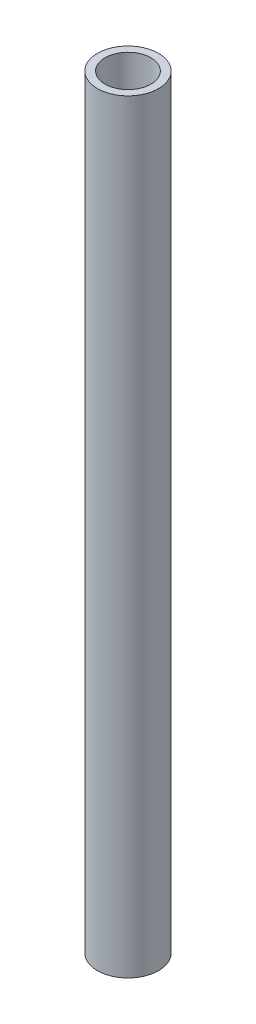
ISO-10303-21;
HEADER;
FILE_DESCRIPTION(('STEP AP214'),'2;1');
FILE_NAME('part.step','',(''),(''),'','','');
FILE_SCHEMA(('AUTOMOTIVE_DESIGN { 1 0 10303 214 1 1 1 1 }'));
ENDSEC;
DATA;
#1=APPLICATION_CONTEXT('core data for automotive mechanical design processes');
#2=APPLICATION_PROTOCOL_DEFINITION('international standard','automotive_design',2000,#1);
#3=PRODUCT_CONTEXT('',#1,'mechanical');
#4=PRODUCT('Part','Part','',(#3));
#5=PRODUCT_RELATED_PRODUCT_CATEGORY('part','',(#4));
#6=PRODUCT_DEFINITION_FORMATION('','',#4);
#7=PRODUCT_DEFINITION_CONTEXT('part definition',#1,'design');
#8=PRODUCT_DEFINITION('design','',#6,#7);
#9=PRODUCT_DEFINITION_SHAPE('','',#8);
#10=(LENGTH_UNIT() NAMED_UNIT(*) SI_UNIT(.MILLI.,.METRE.));
#11=(NAMED_UNIT(*) PLANE_ANGLE_UNIT() SI_UNIT($,.RADIAN.));
#12=(NAMED_UNIT(*) SI_UNIT($,.STERADIAN.) SOLID_ANGLE_UNIT());
#13=UNCERTAINTY_MEASURE_WITH_UNIT(LENGTH_MEASURE(1.E-05),#10,'distance_accuracy_value','');
#14=(GEOMETRIC_REPRESENTATION_CONTEXT(3) GLOBAL_UNCERTAINTY_ASSIGNED_CONTEXT((#13)) GLOBAL_UNIT_ASSIGNED_CONTEXT((#10,
#11,#12)) REPRESENTATION_CONTEXT('',''));
#15=CARTESIAN_POINT('',(0.,0.,0.));
#16=DIRECTION('',(0.,0.,1.));
#17=DIRECTION('',(1.,0.,0.));
#18=AXIS2_PLACEMENT_3D('',#15,#16,#17);
#19=CARTESIAN_POINT('',(0.,100.,0.));
#20=DIRECTION('',(0.,1.,0.));
#21=DIRECTION('',(0.,0.,1.));
#22=AXIS2_PLACEMENT_3D('',#19,#20,#21);
#23=PLANE('',#22);
#24=CARTESIAN_POINT('',(0.,100.,0.));
#25=DIRECTION('',(0.,1.,0.));
#26=DIRECTION('',(0.,0.,1.));
#27=AXIS2_PLACEMENT_3D('',#24,#25,#26);
#28=CIRCLE('',#27,4.);
#29=CARTESIAN_POINT('',(0.,100.,4.));
#30=VERTEX_POINT('',#29);
#31=EDGE_CURVE('E10',#30,#30,#28,.T.);
#32=ORIENTED_EDGE('',*,*,#31,.T.);
#33=EDGE_LOOP('',(#32));
#34=FACE_BOUND('',#33,.T.);
#35=CARTESIAN_POINT('',(0.,100.,0.));
#36=DIRECTION('',(0.,1.,0.));
#37=DIRECTION('',(0.,0.,1.));
#38=AXIS2_PLACEMENT_3D('',#35,#36,#37);
#39=CIRCLE('',#38,3.);
#40=CARTESIAN_POINT('',(0.,100.,3.));
#41=VERTEX_POINT('',#40);
#42=EDGE_CURVE('E58',#41,#41,#39,.T.);
#43=ORIENTED_EDGE('',*,*,#42,.F.);
#44=EDGE_LOOP('',(#43));
#45=FACE_BOUND('',#44,.T.);
#46=ADVANCED_FACE('F45',(#34,#45),#23,.T.);
#47=CARTESIAN_POINT('',(0.,0.,0.));
#48=DIRECTION('',(0.,1.,0.));
#49=DIRECTION('',(0.,0.,1.));
#50=AXIS2_PLACEMENT_3D('',#47,#48,#49);
#51=PLANE('',#50);
#52=CARTESIAN_POINT('',(0.,0.,0.));
#53=DIRECTION('',(0.,1.,0.));
#54=DIRECTION('',(0.,0.,1.));
#55=AXIS2_PLACEMENT_3D('',#52,#53,#54);
#56=CIRCLE('',#55,4.);
#57=CARTESIAN_POINT('',(0.,0.,4.));
#58=VERTEX_POINT('',#57);
#59=EDGE_CURVE('E49',#58,#58,#56,.T.);
#60=ORIENTED_EDGE('',*,*,#59,.F.);
#61=EDGE_LOOP('',(#60));
#62=FACE_BOUND('',#61,.T.);
#63=CARTESIAN_POINT('',(0.,0.,0.));
#64=DIRECTION('',(0.,1.,0.));
#65=DIRECTION('',(0.,0.,1.));
#66=AXIS2_PLACEMENT_3D('',#63,#64,#65);
#67=CIRCLE('',#66,3.);
#68=CARTESIAN_POINT('',(0.,0.,3.));
#69=VERTEX_POINT('',#68);
#70=EDGE_CURVE('E60',#69,#69,#67,.T.);
#71=ORIENTED_EDGE('',*,*,#70,.T.);
#72=EDGE_LOOP('',(#71));
#73=FACE_BOUND('',#72,.T.);
#74=ADVANCED_FACE('F72',(#62,#73),#51,.F.);
#75=CARTESIAN_POINT('',(0.,100.,0.));
#76=DIRECTION('',(0.,-1.,0.));
#77=DIRECTION('',(0.,0.,-1.));
#78=AXIS2_PLACEMENT_3D('',#75,#76,#77);
#79=CYLINDRICAL_SURFACE('',#78,4.);
#80=ORIENTED_EDGE('',*,*,#31,.F.);
#81=EDGE_LOOP('',(#80));
#82=FACE_BOUND('',#81,.T.);
#83=ORIENTED_EDGE('',*,*,#59,.T.);
#84=EDGE_LOOP('',(#83));
#85=FACE_BOUND('',#84,.T.);
#86=ADVANCED_FACE('F47',(#82,#85),#79,.T.);
#87=CARTESIAN_POINT('',(0.,100.,0.));
#88=DIRECTION('',(0.,-1.,0.));
#89=DIRECTION('',(0.,0.,-1.));
#90=AXIS2_PLACEMENT_3D('',#87,#88,#89);
#91=CYLINDRICAL_SURFACE('',#90,3.);
#92=ORIENTED_EDGE('',*,*,#42,.T.);
#93=EDGE_LOOP('',(#92));
#94=FACE_BOUND('',#93,.T.);
#95=ORIENTED_EDGE('',*,*,#70,.F.);
#96=EDGE_LOOP('',(#95));
#97=FACE_BOUND('',#96,.T.);
#98=ADVANCED_FACE('F68',(#94,#97),#91,.F.);
#99=CLOSED_SHELL('',(#46,#74,#86,#98));
#100=MANIFOLD_SOLID_BREP('B2',#99);
#101=ADVANCED_BREP_SHAPE_REPRESENTATION('',(#18,#100),#14);
#102=SHAPE_DEFINITION_REPRESENTATION(#9,#101);
ENDSEC;
END-ISO-10303-21;
